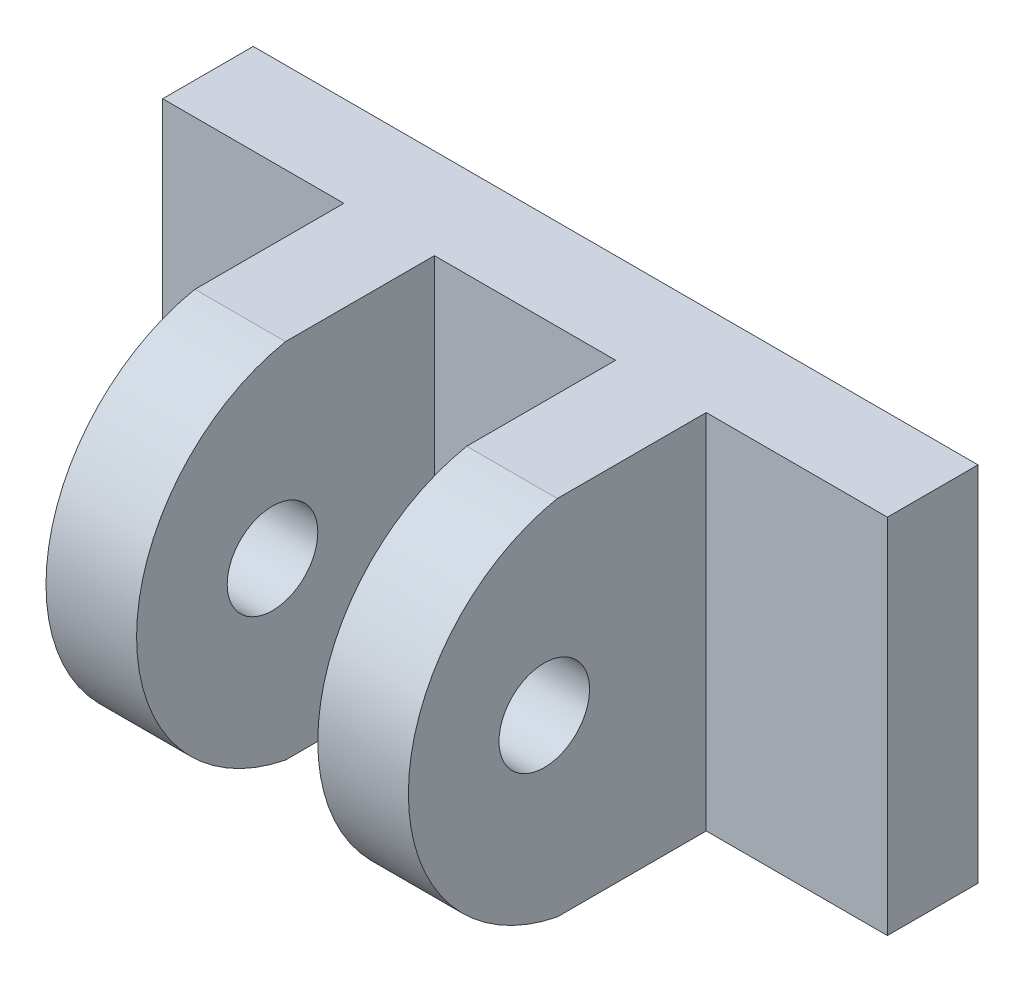
ISO-10303-21;
HEADER;
FILE_DESCRIPTION(('STEP AP214'),'2;1');
FILE_NAME('part.step','',(''),(''),'','','');
FILE_SCHEMA(('AUTOMOTIVE_DESIGN { 1 0 10303 214 1 1 1 1 }'));
ENDSEC;
DATA;
#1=APPLICATION_CONTEXT('core data for automotive mechanical design processes');
#2=APPLICATION_PROTOCOL_DEFINITION('international standard','automotive_design',2000,#1);
#3=PRODUCT_CONTEXT('',#1,'mechanical');
#4=PRODUCT('Part','Part','',(#3));
#5=PRODUCT_RELATED_PRODUCT_CATEGORY('part','',(#4));
#6=PRODUCT_DEFINITION_FORMATION('','',#4);
#7=PRODUCT_DEFINITION_CONTEXT('part definition',#1,'design');
#8=PRODUCT_DEFINITION('design','',#6,#7);
#9=PRODUCT_DEFINITION_SHAPE('','',#8);
#10=(LENGTH_UNIT() NAMED_UNIT(*) SI_UNIT(.MILLI.,.METRE.));
#11=(NAMED_UNIT(*) PLANE_ANGLE_UNIT() SI_UNIT($,.RADIAN.));
#12=(NAMED_UNIT(*) SI_UNIT($,.STERADIAN.) SOLID_ANGLE_UNIT());
#13=UNCERTAINTY_MEASURE_WITH_UNIT(LENGTH_MEASURE(1.E-05),#10,'distance_accuracy_value','');
#14=(GEOMETRIC_REPRESENTATION_CONTEXT(3) GLOBAL_UNCERTAINTY_ASSIGNED_CONTEXT((#13)) GLOBAL_UNIT_ASSIGNED_CONTEXT((#10,
#11,#12)) REPRESENTATION_CONTEXT('',''));
#15=CARTESIAN_POINT('',(0.,0.,0.));
#16=DIRECTION('',(0.,0.,1.));
#17=DIRECTION('',(1.,0.,0.));
#18=AXIS2_PLACEMENT_3D('',#15,#16,#17);
#19=CARTESIAN_POINT('',(6.35,-12.7,16.7885977658933));
#20=DIRECTION('',(1.,0.,0.));
#21=DIRECTION('',(0.,0.,-1.));
#22=AXIS2_PLACEMENT_3D('',#19,#20,#21);
#23=PLANE('',#22);
#24=CARTESIAN_POINT('',(6.35,0.,17.7021955317866));
#25=DIRECTION('',(1.,0.,0.));
#26=DIRECTION('',(0.,0.,-1.));
#27=AXIS2_PLACEMENT_3D('',#24,#25,#26);
#28=CIRCLE('',#27,3.175);
#29=CARTESIAN_POINT('',(6.35,0.,14.5271955317865));
#30=VERTEX_POINT('',#29);
#31=EDGE_CURVE('E157',#30,#30,#28,.T.);
#32=ORIENTED_EDGE('',*,*,#31,.T.);
#33=EDGE_LOOP('',(#32));
#34=FACE_BOUND('',#33,.T.);
#35=DIRECTION('',(0.,0.,-1.));
#36=VECTOR('',#35,1.);
#37=CARTESIAN_POINT('',(6.35,-12.7,16.7885977658933));
#38=LINE('',#37,#36);
#39=CARTESIAN_POINT('',(6.35,-12.7,16.7885977658933));
#40=VERTEX_POINT('',#39);
#41=CARTESIAN_POINT('',(6.35,-12.7,6.35));
#42=VERTEX_POINT('',#41);
#43=EDGE_CURVE('E150',#40,#42,#38,.T.);
#44=ORIENTED_EDGE('',*,*,#43,.F.);
#45=CARTESIAN_POINT('',(6.35,0.,14.2822421300408));
#46=DIRECTION('',(1.,0.,0.));
#47=DIRECTION('',(0.,0.,-1.));
#48=AXIS2_PLACEMENT_3D('',#45,#46,#47);
#49=CIRCLE('',#48,12.9449534017458);
#50=CARTESIAN_POINT('',(6.35,12.7,16.7885977658932));
#51=VERTEX_POINT('',#50);
#52=EDGE_CURVE('E205',#51,#40,#49,.T.);
#53=ORIENTED_EDGE('',*,*,#52,.F.);
#54=DIRECTION('',(0.,0.,-1.));
#55=VECTOR('',#54,1.);
#56=CARTESIAN_POINT('',(6.35,12.7,16.7885977658933));
#57=LINE('',#56,#55);
#58=CARTESIAN_POINT('',(6.35,12.7,6.35));
#59=VERTEX_POINT('',#58);
#60=EDGE_CURVE('E177',#51,#59,#57,.T.);
#61=ORIENTED_EDGE('',*,*,#60,.T.);
#62=DIRECTION('',(0.,1.,0.));
#63=VECTOR('',#62,1.);
#64=CARTESIAN_POINT('',(6.35,-12.7,6.35));
#65=LINE('',#64,#63);
#66=EDGE_CURVE('E179',#42,#59,#65,.T.);
#67=ORIENTED_EDGE('',*,*,#66,.F.);
#68=EDGE_LOOP('',(#44,#53,#61,#67));
#69=FACE_BOUND('',#68,.T.);
#70=ADVANCED_FACE('F17',(#34,#69),#23,.F.);
#71=CARTESIAN_POINT('',(-6.35,-12.7,16.7885977658933));
#72=DIRECTION('',(1.,0.,0.));
#73=DIRECTION('',(0.,0.,-1.));
#74=AXIS2_PLACEMENT_3D('',#71,#72,#73);
#75=PLANE('',#74);
#76=CARTESIAN_POINT('',(-6.35,0.,17.7021955317866));
#77=DIRECTION('',(1.,0.,0.));
#78=DIRECTION('',(0.,0.,-1.));
#79=AXIS2_PLACEMENT_3D('',#76,#77,#78);
#80=CIRCLE('',#79,3.175);
#81=CARTESIAN_POINT('',(-6.35,0.,14.5271955317865));
#82=VERTEX_POINT('',#81);
#83=EDGE_CURVE('E265',#82,#82,#80,.T.);
#84=ORIENTED_EDGE('',*,*,#83,.F.);
#85=EDGE_LOOP('',(#84));
#86=FACE_BOUND('',#85,.T.);
#87=CARTESIAN_POINT('',(-6.35,0.,14.2822421300408));
#88=DIRECTION('',(1.,0.,0.));
#89=DIRECTION('',(0.,0.,-1.));
#90=AXIS2_PLACEMENT_3D('',#87,#88,#89);
#91=CIRCLE('',#90,12.9449534017458);
#92=CARTESIAN_POINT('',(-6.35,12.7,16.7885977658932));
#93=VERTEX_POINT('',#92);
#94=CARTESIAN_POINT('',(-6.35,-12.7,16.7885977658933));
#95=VERTEX_POINT('',#94);
#96=EDGE_CURVE('E35',#93,#95,#91,.T.);
#97=ORIENTED_EDGE('',*,*,#96,.T.);
#98=DIRECTION('',(0.,0.,-1.));
#99=VECTOR('',#98,1.);
#100=CARTESIAN_POINT('',(-6.35,-12.7,16.7885977658933));
#101=LINE('',#100,#99);
#102=CARTESIAN_POINT('',(-6.35,-12.7,6.35));
#103=VERTEX_POINT('',#102);
#104=EDGE_CURVE('E126',#95,#103,#101,.T.);
#105=ORIENTED_EDGE('',*,*,#104,.T.);
#106=DIRECTION('',(0.,1.,0.));
#107=VECTOR('',#106,1.);
#108=CARTESIAN_POINT('',(-6.35,-12.7,6.35));
#109=LINE('',#108,#107);
#110=CARTESIAN_POINT('',(-6.35,12.7,6.35));
#111=VERTEX_POINT('',#110);
#112=EDGE_CURVE('E183',#103,#111,#109,.T.);
#113=ORIENTED_EDGE('',*,*,#112,.T.);
#114=DIRECTION('',(0.,0.,-1.));
#115=VECTOR('',#114,1.);
#116=CARTESIAN_POINT('',(-6.35,12.7,16.7885977658933));
#117=LINE('',#116,#115);
#118=EDGE_CURVE('E156',#93,#111,#117,.T.);
#119=ORIENTED_EDGE('',*,*,#118,.F.);
#120=EDGE_LOOP('',(#97,#105,#113,#119));
#121=FACE_BOUND('',#120,.T.);
#122=ADVANCED_FACE('F197',(#86,#121),#75,.T.);
#123=CARTESIAN_POINT('',(-12.7,-12.7,0.));
#124=DIRECTION('',(0.,0.,-1.));
#125=DIRECTION('',(-1.,0.,0.));
#126=AXIS2_PLACEMENT_3D('',#123,#124,#125);
#127=PLANE('',#126);
#128=DIRECTION('',(-1.,0.,0.));
#129=VECTOR('',#128,1.);
#130=CARTESIAN_POINT('',(-12.7,12.7,0.));
#131=LINE('',#130,#129);
#132=CARTESIAN_POINT('',(25.4,12.7,0.));
#133=VERTEX_POINT('',#132);
#134=CARTESIAN_POINT('',(-25.4,12.7,0.));
#135=VERTEX_POINT('',#134);
#136=EDGE_CURVE('E167',#133,#135,#131,.T.);
#137=ORIENTED_EDGE('',*,*,#136,.F.);
#138=DIRECTION('',(0.,1.,0.));
#139=VECTOR('',#138,1.);
#140=CARTESIAN_POINT('',(25.4,-12.7,0.));
#141=LINE('',#140,#139);
#142=CARTESIAN_POINT('',(25.4,-12.7,0.));
#143=VERTEX_POINT('',#142);
#144=EDGE_CURVE('E189',#143,#133,#141,.T.);
#145=ORIENTED_EDGE('',*,*,#144,.F.);
#146=DIRECTION('',(-1.,0.,0.));
#147=VECTOR('',#146,1.);
#148=CARTESIAN_POINT('',(-12.7,-12.7,0.));
#149=LINE('',#148,#147);
#150=CARTESIAN_POINT('',(-25.4,-12.7,0.));
#151=VERTEX_POINT('',#150);
#152=EDGE_CURVE('E140',#143,#151,#149,.T.);
#153=ORIENTED_EDGE('',*,*,#152,.T.);
#154=DIRECTION('',(0.,1.,0.));
#155=VECTOR('',#154,1.);
#156=CARTESIAN_POINT('',(-25.4,-12.7,0.));
#157=LINE('',#156,#155);
#158=EDGE_CURVE('E152',#151,#135,#157,.T.);
#159=ORIENTED_EDGE('',*,*,#158,.T.);
#160=EDGE_LOOP('',(#137,#145,#153,#159));
#161=FACE_BOUND('',#160,.T.);
#162=ADVANCED_FACE('F222',(#161),#127,.T.);
#163=CARTESIAN_POINT('',(25.4,-12.7,3.175));
#164=DIRECTION('',(-1.,0.,0.));
#165=DIRECTION('',(0.,0.,1.));
#166=AXIS2_PLACEMENT_3D('',#163,#164,#165);
#167=PLANE('',#166);
#168=DIRECTION('',(0.,0.,1.));
#169=VECTOR('',#168,1.);
#170=CARTESIAN_POINT('',(25.4,12.7,3.175));
#171=LINE('',#170,#169);
#172=CARTESIAN_POINT('',(25.4,12.7,6.35));
#173=VERTEX_POINT('',#172);
#174=EDGE_CURVE('E170',#133,#173,#171,.T.);
#175=ORIENTED_EDGE('',*,*,#174,.T.);
#176=DIRECTION('',(0.,1.,0.));
#177=VECTOR('',#176,1.);
#178=CARTESIAN_POINT('',(25.4,-12.7,6.35));
#179=LINE('',#178,#177);
#180=CARTESIAN_POINT('',(25.4,-12.7,6.35));
#181=VERTEX_POINT('',#180);
#182=EDGE_CURVE('E186',#181,#173,#179,.T.);
#183=ORIENTED_EDGE('',*,*,#182,.F.);
#184=DIRECTION('',(0.,0.,1.));
#185=VECTOR('',#184,1.);
#186=CARTESIAN_POINT('',(25.4,-12.7,3.175));
#187=LINE('',#186,#185);
#188=EDGE_CURVE('E143',#143,#181,#187,.T.);
#189=ORIENTED_EDGE('',*,*,#188,.F.);
#190=ORIENTED_EDGE('',*,*,#144,.T.);
#191=EDGE_LOOP('',(#175,#183,#189,#190));
#192=FACE_BOUND('',#191,.T.);
#193=ADVANCED_FACE('F232',(#192),#167,.F.);
#194=CARTESIAN_POINT('',(19.05,-12.7,6.35));
#195=DIRECTION('',(0.,0.,-1.));
#196=DIRECTION('',(-1.,0.,0.));
#197=AXIS2_PLACEMENT_3D('',#194,#195,#196);
#198=PLANE('',#197);
#199=DIRECTION('',(-1.,0.,0.));
#200=VECTOR('',#199,1.);
#201=CARTESIAN_POINT('',(19.05,12.7,6.35));
#202=LINE('',#201,#200);
#203=CARTESIAN_POINT('',(12.7,12.7,6.35));
#204=VERTEX_POINT('',#203);
#205=EDGE_CURVE('E172',#173,#204,#202,.T.);
#206=ORIENTED_EDGE('',*,*,#205,.T.);
#207=DIRECTION('',(0.,1.,0.));
#208=VECTOR('',#207,1.);
#209=CARTESIAN_POINT('',(12.7,-12.7,6.35));
#210=LINE('',#209,#208);
#211=CARTESIAN_POINT('',(12.7,-12.7,6.35));
#212=VERTEX_POINT('',#211);
#213=EDGE_CURVE('E182',#212,#204,#210,.T.);
#214=ORIENTED_EDGE('',*,*,#213,.F.);
#215=DIRECTION('',(-1.,0.,0.));
#216=VECTOR('',#215,1.);
#217=CARTESIAN_POINT('',(19.05,-12.7,6.35));
#218=LINE('',#217,#216);
#219=EDGE_CURVE('E145',#181,#212,#218,.T.);
#220=ORIENTED_EDGE('',*,*,#219,.F.);
#221=ORIENTED_EDGE('',*,*,#182,.T.);
#222=EDGE_LOOP('',(#206,#214,#220,#221));
#223=FACE_BOUND('',#222,.T.);
#224=ADVANCED_FACE('F216',(#223),#198,.F.);
#225=CARTESIAN_POINT('',(12.7,-12.7,16.7885977658933));
#226=DIRECTION('',(-1.,0.,0.));
#227=DIRECTION('',(0.,0.,1.));
#228=AXIS2_PLACEMENT_3D('',#225,#226,#227);
#229=PLANE('',#228);
#230=CARTESIAN_POINT('',(12.7,0.,17.7021955317866));
#231=DIRECTION('',(-1.,0.,0.));
#232=DIRECTION('',(0.,0.,1.));
#233=AXIS2_PLACEMENT_3D('',#230,#231,#232);
#234=CIRCLE('',#233,3.175);
#235=CARTESIAN_POINT('',(12.7,0.,20.8771955317866));
#236=VERTEX_POINT('',#235);
#237=EDGE_CURVE('E261',#236,#236,#234,.T.);
#238=ORIENTED_EDGE('',*,*,#237,.T.);
#239=EDGE_LOOP('',(#238));
#240=FACE_BOUND('',#239,.T.);
#241=CARTESIAN_POINT('',(12.7,0.,14.2822421300408));
#242=DIRECTION('',(1.,0.,0.));
#243=DIRECTION('',(0.,0.,-1.));
#244=AXIS2_PLACEMENT_3D('',#241,#242,#243);
#245=CIRCLE('',#244,12.9449534017458);
#246=CARTESIAN_POINT('',(12.7,12.7,16.7885977658932));
#247=VERTEX_POINT('',#246);
#248=CARTESIAN_POINT('',(12.7,-12.7,16.7885977658933));
#249=VERTEX_POINT('',#248);
#250=EDGE_CURVE('E117',#247,#249,#245,.T.);
#251=ORIENTED_EDGE('',*,*,#250,.T.);
#252=DIRECTION('',(0.,0.,1.));
#253=VECTOR('',#252,1.);
#254=CARTESIAN_POINT('',(12.7,-12.7,16.7885977658933));
#255=LINE('',#254,#253);
#256=EDGE_CURVE('E147',#212,#249,#255,.T.);
#257=ORIENTED_EDGE('',*,*,#256,.F.);
#258=ORIENTED_EDGE('',*,*,#213,.T.);
#259=DIRECTION('',(0.,0.,1.));
#260=VECTOR('',#259,1.);
#261=CARTESIAN_POINT('',(12.7,12.7,16.7885977658933));
#262=LINE('',#261,#260);
#263=EDGE_CURVE('E174',#204,#247,#262,.T.);
#264=ORIENTED_EDGE('',*,*,#263,.T.);
#265=EDGE_LOOP('',(#251,#257,#258,#264));
#266=FACE_BOUND('',#265,.T.);
#267=ADVANCED_FACE('F211',(#240,#266),#229,.F.);
#268=CARTESIAN_POINT('',(-3.175,-12.7,6.35));
#269=DIRECTION('',(0.,0.,1.));
#270=DIRECTION('',(1.,0.,0.));
#271=AXIS2_PLACEMENT_3D('',#268,#269,#270);
#272=PLANE('',#271);
#273=DIRECTION('',(1.,0.,0.));
#274=VECTOR('',#273,1.);
#275=CARTESIAN_POINT('',(-3.175,12.7,6.35));
#276=LINE('',#275,#274);
#277=EDGE_CURVE('E153',#111,#59,#276,.T.);
#278=ORIENTED_EDGE('',*,*,#277,.F.);
#279=ORIENTED_EDGE('',*,*,#112,.F.);
#280=DIRECTION('',(1.,0.,0.));
#281=VECTOR('',#280,1.);
#282=CARTESIAN_POINT('',(-3.175,-12.7,6.35));
#283=LINE('',#282,#281);
#284=EDGE_CURVE('E134',#103,#42,#283,.T.);
#285=ORIENTED_EDGE('',*,*,#284,.T.);
#286=ORIENTED_EDGE('',*,*,#66,.T.);
#287=EDGE_LOOP('',(#278,#279,#285,#286));
#288=FACE_BOUND('',#287,.T.);
#289=ADVANCED_FACE('F19',(#288),#272,.T.);
#290=CARTESIAN_POINT('',(-12.7,-12.7,16.7885977658933));
#291=DIRECTION('',(-1.,0.,0.));
#292=DIRECTION('',(0.,0.,1.));
#293=AXIS2_PLACEMENT_3D('',#290,#291,#292);
#294=PLANE('',#293);
#295=DIRECTION('',(0.,0.,1.));
#296=VECTOR('',#295,1.);
#297=CARTESIAN_POINT('',(-12.7,-12.7,16.7885977658933));
#298=LINE('',#297,#296);
#299=CARTESIAN_POINT('',(-12.7,-12.7,6.35));
#300=VERTEX_POINT('',#299);
#301=CARTESIAN_POINT('',(-12.7,-12.7,16.7885977658933));
#302=VERTEX_POINT('',#301);
#303=EDGE_CURVE('E123',#300,#302,#298,.T.);
#304=ORIENTED_EDGE('',*,*,#303,.T.);
#305=CARTESIAN_POINT('',(-12.7,0.,14.2822421300408));
#306=DIRECTION('',(1.,0.,0.));
#307=DIRECTION('',(0.,0.,-1.));
#308=AXIS2_PLACEMENT_3D('',#305,#306,#307);
#309=CIRCLE('',#308,12.9449534017458);
#310=CARTESIAN_POINT('',(-12.7,12.7,16.7885977658932));
#311=VERTEX_POINT('',#310);
#312=EDGE_CURVE('E107',#311,#302,#309,.T.);
#313=ORIENTED_EDGE('',*,*,#312,.F.);
#314=DIRECTION('',(0.,0.,1.));
#315=VECTOR('',#314,1.);
#316=CARTESIAN_POINT('',(-12.7,12.7,16.7885977658933));
#317=LINE('',#316,#315);
#318=CARTESIAN_POINT('',(-12.7,12.7,6.35));
#319=VERTEX_POINT('',#318);
#320=EDGE_CURVE('E159',#319,#311,#317,.T.);
#321=ORIENTED_EDGE('',*,*,#320,.F.);
#322=DIRECTION('',(0.,1.,0.));
#323=VECTOR('',#322,1.);
#324=CARTESIAN_POINT('',(-12.7,-12.7,6.35));
#325=LINE('',#324,#323);
#326=EDGE_CURVE('E129',#300,#319,#325,.T.);
#327=ORIENTED_EDGE('',*,*,#326,.F.);
#328=EDGE_LOOP('',(#304,#313,#321,#327));
#329=FACE_BOUND('',#328,.T.);
#330=CARTESIAN_POINT('',(-12.7,0.,17.7021955317866));
#331=DIRECTION('',(-1.,0.,0.));
#332=DIRECTION('',(0.,0.,1.));
#333=AXIS2_PLACEMENT_3D('',#330,#331,#332);
#334=CIRCLE('',#333,3.175);
#335=CARTESIAN_POINT('',(-12.7,0.,20.8771955317866));
#336=VERTEX_POINT('',#335);
#337=EDGE_CURVE('E21',#336,#336,#334,.T.);
#338=ORIENTED_EDGE('',*,*,#337,.F.);
#339=EDGE_LOOP('',(#338));
#340=FACE_BOUND('',#339,.T.);
#341=ADVANCED_FACE('F127',(#329,#340),#294,.T.);
#342=CARTESIAN_POINT('',(-19.05,-12.7,6.35));
#343=DIRECTION('',(0.,0.,1.));
#344=DIRECTION('',(1.,0.,0.));
#345=AXIS2_PLACEMENT_3D('',#342,#343,#344);
#346=PLANE('',#345);
#347=DIRECTION('',(1.,0.,0.));
#348=VECTOR('',#347,1.);
#349=CARTESIAN_POINT('',(-19.05,12.7,6.35));
#350=LINE('',#349,#348);
#351=CARTESIAN_POINT('',(-25.4,12.7,6.35));
#352=VERTEX_POINT('',#351);
#353=EDGE_CURVE('E161',#352,#319,#350,.T.);
#354=ORIENTED_EDGE('',*,*,#353,.F.);
#355=DIRECTION('',(0.,1.,0.));
#356=VECTOR('',#355,1.);
#357=CARTESIAN_POINT('',(-25.4,-12.7,6.35));
#358=LINE('',#357,#356);
#359=CARTESIAN_POINT('',(-25.4,-12.7,6.35));
#360=VERTEX_POINT('',#359);
#361=EDGE_CURVE('E192',#360,#352,#358,.T.);
#362=ORIENTED_EDGE('',*,*,#361,.F.);
#363=DIRECTION('',(1.,0.,0.));
#364=VECTOR('',#363,1.);
#365=CARTESIAN_POINT('',(-19.05,-12.7,6.35));
#366=LINE('',#365,#364);
#367=EDGE_CURVE('E130',#360,#300,#366,.T.);
#368=ORIENTED_EDGE('',*,*,#367,.T.);
#369=ORIENTED_EDGE('',*,*,#326,.T.);
#370=EDGE_LOOP('',(#354,#362,#368,#369));
#371=FACE_BOUND('',#370,.T.);
#372=ADVANCED_FACE('F231',(#371),#346,.T.);
#373=CARTESIAN_POINT('',(-25.4,-12.7,3.175));
#374=DIRECTION('',(-1.,0.,0.));
#375=DIRECTION('',(0.,0.,1.));
#376=AXIS2_PLACEMENT_3D('',#373,#374,#375);
#377=PLANE('',#376);
#378=DIRECTION('',(0.,0.,1.));
#379=VECTOR('',#378,1.);
#380=CARTESIAN_POINT('',(-25.4,12.7,3.175));
#381=LINE('',#380,#379);
#382=EDGE_CURVE('E164',#135,#352,#381,.T.);
#383=ORIENTED_EDGE('',*,*,#382,.F.);
#384=ORIENTED_EDGE('',*,*,#158,.F.);
#385=DIRECTION('',(0.,0.,1.));
#386=VECTOR('',#385,1.);
#387=CARTESIAN_POINT('',(-25.4,-12.7,3.175));
#388=LINE('',#387,#386);
#389=EDGE_CURVE('E132',#151,#360,#388,.T.);
#390=ORIENTED_EDGE('',*,*,#389,.T.);
#391=ORIENTED_EDGE('',*,*,#361,.T.);
#392=EDGE_LOOP('',(#383,#384,#390,#391));
#393=FACE_BOUND('',#392,.T.);
#394=ADVANCED_FACE('F228',(#393),#377,.T.);
#395=CARTESIAN_POINT('',(0.,-12.7,13.6135977658933));
#396=DIRECTION('',(0.,-1.,0.));
#397=DIRECTION('',(1.,0.,0.));
#398=AXIS2_PLACEMENT_3D('',#395,#396,#397);
#399=PLANE('',#398);
#400=DIRECTION('',(1.,0.,0.));
#401=VECTOR('',#400,1.);
#402=CARTESIAN_POINT('',(-12.7,-12.7,16.7885977658933));
#403=LINE('',#402,#401);
#404=EDGE_CURVE('E28',#302,#95,#403,.T.);
#405=ORIENTED_EDGE('',*,*,#404,.F.);
#406=ORIENTED_EDGE('',*,*,#303,.F.);
#407=ORIENTED_EDGE('',*,*,#367,.F.);
#408=ORIENTED_EDGE('',*,*,#389,.F.);
#409=ORIENTED_EDGE('',*,*,#152,.F.);
#410=ORIENTED_EDGE('',*,*,#188,.T.);
#411=ORIENTED_EDGE('',*,*,#219,.T.);
#412=ORIENTED_EDGE('',*,*,#256,.T.);
#413=EDGE_CURVE('E11',#40,#249,#403,.T.);
#414=ORIENTED_EDGE('',*,*,#413,.F.);
#415=ORIENTED_EDGE('',*,*,#43,.T.);
#416=ORIENTED_EDGE('',*,*,#284,.F.);
#417=ORIENTED_EDGE('',*,*,#104,.F.);
#418=EDGE_LOOP('',(#405,#406,#407,#408,#409,#410,#411,#412,#414,#415,#416,#417));
#419=FACE_BOUND('',#418,.T.);
#420=ADVANCED_FACE('F121',(#419),#399,.T.);
#421=CARTESIAN_POINT('',(0.,12.7,13.6135977658933));
#422=DIRECTION('',(0.,-1.,0.));
#423=DIRECTION('',(1.,0.,0.));
#424=AXIS2_PLACEMENT_3D('',#421,#422,#423);
#425=PLANE('',#424);
#426=ORIENTED_EDGE('',*,*,#320,.T.);
#427=DIRECTION('',(1.,0.,0.));
#428=VECTOR('',#427,1.);
#429=CARTESIAN_POINT('',(-12.7,12.7,16.7885977658932));
#430=LINE('',#429,#428);
#431=EDGE_CURVE('E112',#311,#93,#430,.T.);
#432=ORIENTED_EDGE('',*,*,#431,.T.);
#433=ORIENTED_EDGE('',*,*,#118,.T.);
#434=ORIENTED_EDGE('',*,*,#277,.T.);
#435=ORIENTED_EDGE('',*,*,#60,.F.);
#436=EDGE_CURVE('E26',#51,#247,#430,.T.);
#437=ORIENTED_EDGE('',*,*,#436,.T.);
#438=ORIENTED_EDGE('',*,*,#263,.F.);
#439=ORIENTED_EDGE('',*,*,#205,.F.);
#440=ORIENTED_EDGE('',*,*,#174,.F.);
#441=ORIENTED_EDGE('',*,*,#136,.T.);
#442=ORIENTED_EDGE('',*,*,#382,.T.);
#443=ORIENTED_EDGE('',*,*,#353,.T.);
#444=EDGE_LOOP('',(#426,#432,#433,#434,#435,#437,#438,#439,#440,#441,#442,#443));
#445=FACE_BOUND('',#444,.T.);
#446=ADVANCED_FACE('F203',(#445),#425,.F.);
#447=CARTESIAN_POINT('',(12.7,0.,17.7021955317866));
#448=DIRECTION('',(-1.,0.,0.));
#449=DIRECTION('',(0.,0.,1.));
#450=AXIS2_PLACEMENT_3D('',#447,#448,#449);
#451=CYLINDRICAL_SURFACE('',#450,3.175);
#452=ORIENTED_EDGE('',*,*,#83,.T.);
#453=EDGE_LOOP('',(#452));
#454=FACE_BOUND('',#453,.T.);
#455=ORIENTED_EDGE('',*,*,#337,.T.);
#456=EDGE_LOOP('',(#455));
#457=FACE_BOUND('',#456,.T.);
#458=ADVANCED_FACE('F280',(#454,#457),#451,.F.);
#459=ORIENTED_EDGE('',*,*,#237,.F.);
#460=EDGE_LOOP('',(#459));
#461=FACE_BOUND('',#460,.T.);
#462=ORIENTED_EDGE('',*,*,#31,.F.);
#463=EDGE_LOOP('',(#462));
#464=FACE_BOUND('',#463,.T.);
#465=ADVANCED_FACE('F278',(#461,#464),#451,.F.);
#466=CARTESIAN_POINT('',(-12.7,0.,14.2822421300408));
#467=DIRECTION('',(1.,0.,0.));
#468=DIRECTION('',(0.,0.,-1.));
#469=AXIS2_PLACEMENT_3D('',#466,#467,#468);
#470=CYLINDRICAL_SURFACE('',#469,12.9449534017458);
#471=ORIENTED_EDGE('',*,*,#431,.F.);
#472=ORIENTED_EDGE('',*,*,#312,.T.);
#473=ORIENTED_EDGE('',*,*,#404,.T.);
#474=ORIENTED_EDGE('',*,*,#96,.F.);
#475=EDGE_LOOP('',(#471,#472,#473,#474));
#476=FACE_BOUND('',#475,.T.);
#477=ADVANCED_FACE('F109',(#476),#470,.T.);
#478=ORIENTED_EDGE('',*,*,#52,.T.);
#479=ORIENTED_EDGE('',*,*,#413,.T.);
#480=ORIENTED_EDGE('',*,*,#250,.F.);
#481=ORIENTED_EDGE('',*,*,#436,.F.);
#482=EDGE_LOOP('',(#478,#479,#480,#481));
#483=FACE_BOUND('',#482,.T.);
#484=ADVANCED_FACE('F272',(#483),#470,.T.);
#485=CLOSED_SHELL('',(#70,#122,#162,#193,#224,#267,#289,#341,#372,#394,#420,#446,#458,#465,#477,#484));
#486=MANIFOLD_SOLID_BREP('B1',#485);
#487=ADVANCED_BREP_SHAPE_REPRESENTATION('',(#18,#486),#14);
#488=SHAPE_DEFINITION_REPRESENTATION(#9,#487);
ENDSEC;
END-ISO-10303-21;
